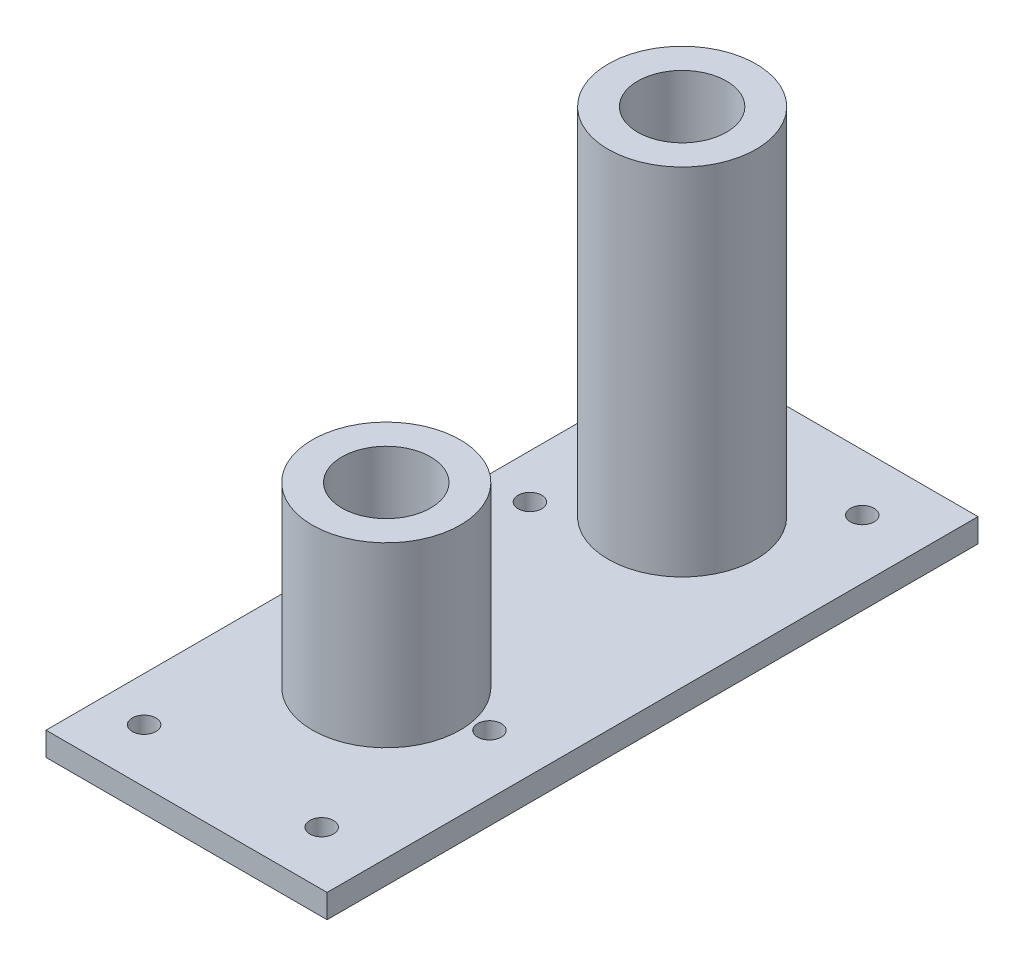
ISO-10303-21;
HEADER;
FILE_DESCRIPTION(('STEP AP214'),'2;1');
FILE_NAME('part.step','',(''),(''),'','','');
FILE_SCHEMA(('AUTOMOTIVE_DESIGN { 1 0 10303 214 1 1 1 1 }'));
ENDSEC;
DATA;
#1=APPLICATION_CONTEXT('core data for automotive mechanical design processes');
#2=APPLICATION_PROTOCOL_DEFINITION('international standard','automotive_design',2000,#1);
#3=PRODUCT_CONTEXT('',#1,'mechanical');
#4=PRODUCT('Part','Part','',(#3));
#5=PRODUCT_RELATED_PRODUCT_CATEGORY('part','',(#4));
#6=PRODUCT_DEFINITION_FORMATION('','',#4);
#7=PRODUCT_DEFINITION_CONTEXT('part definition',#1,'design');
#8=PRODUCT_DEFINITION('design','',#6,#7);
#9=PRODUCT_DEFINITION_SHAPE('','',#8);
#10=(LENGTH_UNIT() NAMED_UNIT(*) SI_UNIT(.MILLI.,.METRE.));
#11=(NAMED_UNIT(*) PLANE_ANGLE_UNIT() SI_UNIT($,.RADIAN.));
#12=(NAMED_UNIT(*) SI_UNIT($,.STERADIAN.) SOLID_ANGLE_UNIT());
#13=UNCERTAINTY_MEASURE_WITH_UNIT(LENGTH_MEASURE(1.E-05),#10,'distance_accuracy_value','');
#14=(GEOMETRIC_REPRESENTATION_CONTEXT(3) GLOBAL_UNCERTAINTY_ASSIGNED_CONTEXT((#13)) GLOBAL_UNIT_ASSIGNED_CONTEXT((#10,
#11,#12)) REPRESENTATION_CONTEXT('',''));
#15=CARTESIAN_POINT('',(0.,0.,0.));
#16=DIRECTION('',(0.,0.,1.));
#17=DIRECTION('',(1.,0.,0.));
#18=AXIS2_PLACEMENT_3D('',#15,#16,#17);
#19=CARTESIAN_POINT('',(0.,0.,0.));
#20=DIRECTION('',(0.,1.,0.));
#21=DIRECTION('',(0.,0.,1.));
#22=AXIS2_PLACEMENT_3D('',#19,#20,#21);
#23=PLANE('',#22);
#24=DIRECTION('',(0.,0.,-1.));
#25=VECTOR('',#24,1.);
#26=CARTESIAN_POINT('',(-9.14772727272729,0.,-6.875));
#27=LINE('',#26,#25);
#28=CARTESIAN_POINT('',(-9.14772727272729,0.,3.125));
#29=VERTEX_POINT('',#28);
#30=CARTESIAN_POINT('',(-9.14772727272729,0.,-6.875));
#31=VERTEX_POINT('',#30);
#32=EDGE_CURVE('E186',#29,#31,#27,.T.);
#33=ORIENTED_EDGE('',*,*,#32,.F.);
#34=DIRECTION('',(1.,0.,0.));
#35=VECTOR('',#34,1.);
#36=CARTESIAN_POINT('',(-19.1477272727273,0.,3.125));
#37=LINE('',#36,#35);
#38=CARTESIAN_POINT('',(-19.1477272727273,0.,3.125));
#39=VERTEX_POINT('',#38);
#40=EDGE_CURVE('E197',#39,#29,#37,.T.);
#41=ORIENTED_EDGE('',*,*,#40,.F.);
#42=DIRECTION('',(0.,0.,1.));
#43=VECTOR('',#42,1.);
#44=CARTESIAN_POINT('',(-19.1477272727273,0.,-6.875));
#45=LINE('',#44,#43);
#46=CARTESIAN_POINT('',(-19.1477272727273,0.,-6.875));
#47=VERTEX_POINT('',#46);
#48=EDGE_CURVE('E216',#47,#39,#45,.T.);
#49=ORIENTED_EDGE('',*,*,#48,.F.);
#50=DIRECTION('',(-1.,0.,0.));
#51=VECTOR('',#50,1.);
#52=CARTESIAN_POINT('',(-19.1477272727273,0.,-6.875));
#53=LINE('',#52,#51);
#54=EDGE_CURVE('E212',#31,#47,#53,.T.);
#55=ORIENTED_EDGE('',*,*,#54,.F.);
#56=EDGE_LOOP('',(#33,#41,#49,#55));
#57=FACE_BOUND('',#56,.T.);
#58=CARTESIAN_POINT('',(-14.1477272727273,0.,-1.875));
#59=DIRECTION('',(0.,1.,0.));
#60=DIRECTION('',(0.,0.,1.));
#61=AXIS2_PLACEMENT_3D('',#58,#59,#60);
#62=CIRCLE('',#61,7.5);
#63=CARTESIAN_POINT('',(-14.1477272727273,0.,5.625));
#64=VERTEX_POINT('',#63);
#65=EDGE_CURVE('E12',#64,#64,#62,.F.);
#66=ORIENTED_EDGE('',*,*,#65,.F.);
#67=EDGE_LOOP('',(#66));
#68=FACE_BOUND('',#67,.T.);
#69=ADVANCED_FACE('F49',(#57,#68),#23,.T.);
#70=DIRECTION('',(0.,0.,-1.));
#71=VECTOR('',#70,1.);
#72=CARTESIAN_POINT('',(-9.14772727272729,0.,43.125));
#73=LINE('',#72,#71);
#74=CARTESIAN_POINT('',(-9.14772727272729,0.,53.125));
#75=VERTEX_POINT('',#74);
#76=CARTESIAN_POINT('',(-9.14772727272729,0.,43.125));
#77=VERTEX_POINT('',#76);
#78=EDGE_CURVE('E73',#75,#77,#73,.T.);
#79=ORIENTED_EDGE('',*,*,#78,.F.);
#80=DIRECTION('',(1.,0.,0.));
#81=VECTOR('',#80,1.);
#82=CARTESIAN_POINT('',(-19.1477272727273,0.,53.125));
#83=LINE('',#82,#81);
#84=CARTESIAN_POINT('',(-19.1477272727273,0.,53.125));
#85=VERTEX_POINT('',#84);
#86=EDGE_CURVE('E160',#85,#75,#83,.T.);
#87=ORIENTED_EDGE('',*,*,#86,.F.);
#88=DIRECTION('',(0.,0.,1.));
#89=VECTOR('',#88,1.);
#90=CARTESIAN_POINT('',(-19.1477272727273,0.,43.125));
#91=LINE('',#90,#89);
#92=CARTESIAN_POINT('',(-19.1477272727273,0.,43.125));
#93=VERTEX_POINT('',#92);
#94=EDGE_CURVE('E164',#93,#85,#91,.T.);
#95=ORIENTED_EDGE('',*,*,#94,.F.);
#96=DIRECTION('',(-1.,0.,0.));
#97=VECTOR('',#96,1.);
#98=CARTESIAN_POINT('',(-19.1477272727273,0.,43.125));
#99=LINE('',#98,#97);
#100=EDGE_CURVE('E176',#77,#93,#99,.T.);
#101=ORIENTED_EDGE('',*,*,#100,.F.);
#102=EDGE_LOOP('',(#79,#87,#95,#101));
#103=FACE_BOUND('',#102,.T.);
#104=CARTESIAN_POINT('',(-14.1477272727273,0.,48.125));
#105=DIRECTION('',(0.,1.,0.));
#106=DIRECTION('',(0.,0.,1.));
#107=AXIS2_PLACEMENT_3D('',#104,#105,#106);
#108=CIRCLE('',#107,7.5);
#109=CARTESIAN_POINT('',(-14.1477272727273,0.,55.625));
#110=VERTEX_POINT('',#109);
#111=EDGE_CURVE('E58',#110,#110,#108,.F.);
#112=ORIENTED_EDGE('',*,*,#111,.F.);
#113=EDGE_LOOP('',(#112));
#114=FACE_BOUND('',#113,.T.);
#115=ADVANCED_FACE('F284',(#103,#114),#23,.T.);
#116=CARTESIAN_POINT('',(-36.6477272727273,-4.,-26.875));
#117=DIRECTION('',(-1.,0.,0.));
#118=DIRECTION('',(0.,0.,1.));
#119=AXIS2_PLACEMENT_3D('',#116,#117,#118);
#120=PLANE('',#119);
#121=DIRECTION('',(0.,0.,1.));
#122=VECTOR('',#121,1.);
#123=CARTESIAN_POINT('',(-36.6477272727273,0.,-26.875));
#124=LINE('',#123,#122);
#125=CARTESIAN_POINT('',(-36.6477272727273,0.,-26.875));
#126=VERTEX_POINT('',#125);
#127=CARTESIAN_POINT('',(-36.6477272727273,0.,83.125));
#128=VERTEX_POINT('',#127);
#129=EDGE_CURVE('E226',#126,#128,#124,.T.);
#130=ORIENTED_EDGE('',*,*,#129,.F.);
#131=DIRECTION('',(0.,1.,0.));
#132=VECTOR('',#131,1.);
#133=CARTESIAN_POINT('',(-36.6477272727273,-4.,-26.875));
#134=LINE('',#133,#132);
#135=CARTESIAN_POINT('',(-36.6477272727273,-4.,-26.875));
#136=VERTEX_POINT('',#135);
#137=EDGE_CURVE('E268',#136,#126,#134,.T.);
#138=ORIENTED_EDGE('',*,*,#137,.F.);
#139=DIRECTION('',(0.,0.,1.));
#140=VECTOR('',#139,1.);
#141=CARTESIAN_POINT('',(-36.6477272727273,-4.,-26.875));
#142=LINE('',#141,#140);
#143=CARTESIAN_POINT('',(-36.6477272727273,-4.,83.125));
#144=VERTEX_POINT('',#143);
#145=EDGE_CURVE('E236',#136,#144,#142,.T.);
#146=ORIENTED_EDGE('',*,*,#145,.T.);
#147=DIRECTION('',(0.,1.,0.));
#148=VECTOR('',#147,1.);
#149=CARTESIAN_POINT('',(-36.6477272727273,-4.,83.125));
#150=LINE('',#149,#148);
#151=EDGE_CURVE('E253',#144,#128,#150,.T.);
#152=ORIENTED_EDGE('',*,*,#151,.T.);
#153=EDGE_LOOP('',(#130,#138,#146,#152));
#154=FACE_BOUND('',#153,.T.);
#155=ADVANCED_FACE('F51',(#154),#120,.T.);
#156=CARTESIAN_POINT('',(-36.6477272727273,-4.,-26.875));
#157=DIRECTION('',(0.,0.,-1.));
#158=DIRECTION('',(-1.,0.,0.));
#159=AXIS2_PLACEMENT_3D('',#156,#157,#158);
#160=PLANE('',#159);
#161=DIRECTION('',(-1.,0.,0.));
#162=VECTOR('',#161,1.);
#163=CARTESIAN_POINT('',(-36.6477272727273,0.,-26.875));
#164=LINE('',#163,#162);
#165=CARTESIAN_POINT('',(10.8522727272727,0.,-26.875));
#166=VERTEX_POINT('',#165);
#167=EDGE_CURVE('E241',#166,#126,#164,.T.);
#168=ORIENTED_EDGE('',*,*,#167,.F.);
#169=DIRECTION('',(0.,1.,0.));
#170=VECTOR('',#169,1.);
#171=CARTESIAN_POINT('',(10.8522727272727,-4.,-26.875));
#172=LINE('',#171,#170);
#173=CARTESIAN_POINT('',(10.8522727272727,-4.,-26.875));
#174=VERTEX_POINT('',#173);
#175=EDGE_CURVE('E271',#174,#166,#172,.T.);
#176=ORIENTED_EDGE('',*,*,#175,.F.);
#177=DIRECTION('',(-1.,0.,0.));
#178=VECTOR('',#177,1.);
#179=CARTESIAN_POINT('',(-36.6477272727273,-4.,-26.875));
#180=LINE('',#179,#178);
#181=EDGE_CURVE('E249',#174,#136,#180,.T.);
#182=ORIENTED_EDGE('',*,*,#181,.T.);
#183=ORIENTED_EDGE('',*,*,#137,.T.);
#184=EDGE_LOOP('',(#168,#176,#182,#183));
#185=FACE_BOUND('',#184,.T.);
#186=ADVANCED_FACE('F293',(#185),#160,.T.);
#187=CARTESIAN_POINT('',(10.8522727272727,-4.,-26.875));
#188=DIRECTION('',(1.,0.,0.));
#189=DIRECTION('',(0.,0.,-1.));
#190=AXIS2_PLACEMENT_3D('',#187,#188,#189);
#191=PLANE('',#190);
#192=DIRECTION('',(0.,0.,-1.));
#193=VECTOR('',#192,1.);
#194=CARTESIAN_POINT('',(10.8522727272727,0.,-26.875));
#195=LINE('',#194,#193);
#196=CARTESIAN_POINT('',(10.8522727272727,0.,83.125));
#197=VERTEX_POINT('',#196);
#198=EDGE_CURVE('E261',#197,#166,#195,.T.);
#199=ORIENTED_EDGE('',*,*,#198,.F.);
#200=DIRECTION('',(0.,1.,0.));
#201=VECTOR('',#200,1.);
#202=CARTESIAN_POINT('',(10.8522727272727,-4.,83.125));
#203=LINE('',#202,#201);
#204=CARTESIAN_POINT('',(10.8522727272727,-4.,83.125));
#205=VERTEX_POINT('',#204);
#206=EDGE_CURVE('E274',#205,#197,#203,.T.);
#207=ORIENTED_EDGE('',*,*,#206,.F.);
#208=DIRECTION('',(0.,0.,-1.));
#209=VECTOR('',#208,1.);
#210=CARTESIAN_POINT('',(10.8522727272727,-4.,-26.875));
#211=LINE('',#210,#209);
#212=EDGE_CURVE('E245',#205,#174,#211,.T.);
#213=ORIENTED_EDGE('',*,*,#212,.T.);
#214=ORIENTED_EDGE('',*,*,#175,.T.);
#215=EDGE_LOOP('',(#199,#207,#213,#214));
#216=FACE_BOUND('',#215,.T.);
#217=ADVANCED_FACE('F346',(#216),#191,.T.);
#218=CARTESIAN_POINT('',(-36.6477272727273,-4.,83.125));
#219=DIRECTION('',(0.,0.,1.));
#220=DIRECTION('',(1.,0.,0.));
#221=AXIS2_PLACEMENT_3D('',#218,#219,#220);
#222=PLANE('',#221);
#223=DIRECTION('',(1.,0.,0.));
#224=VECTOR('',#223,1.);
#225=CARTESIAN_POINT('',(-36.6477272727273,0.,83.125));
#226=LINE('',#225,#224);
#227=EDGE_CURVE('E257',#128,#197,#226,.T.);
#228=ORIENTED_EDGE('',*,*,#227,.F.);
#229=ORIENTED_EDGE('',*,*,#151,.F.);
#230=DIRECTION('',(1.,0.,0.));
#231=VECTOR('',#230,1.);
#232=CARTESIAN_POINT('',(-36.6477272727273,-4.,83.125));
#233=LINE('',#232,#231);
#234=EDGE_CURVE('E240',#144,#205,#233,.T.);
#235=ORIENTED_EDGE('',*,*,#234,.T.);
#236=ORIENTED_EDGE('',*,*,#206,.T.);
#237=EDGE_LOOP('',(#228,#229,#235,#236));
#238=FACE_BOUND('',#237,.T.);
#239=ADVANCED_FACE('F308',(#238),#222,.T.);
#240=CARTESIAN_POINT('',(0.,-4.,0.));
#241=DIRECTION('',(0.,1.,0.));
#242=DIRECTION('',(0.,0.,1.));
#243=AXIS2_PLACEMENT_3D('',#240,#241,#242);
#244=PLANE('',#243);
#245=CARTESIAN_POINT('',(-29.1477272727273,-4.,74.045));
#246=DIRECTION('',(0.,1.,0.));
#247=DIRECTION('',(0.,0.,1.));
#248=AXIS2_PLACEMENT_3D('',#245,#246,#247);
#249=CIRCLE('',#248,2.);
#250=CARTESIAN_POINT('',(-29.1477272727273,-4.,76.045));
#251=VERTEX_POINT('',#250);
#252=EDGE_CURVE('E611',#251,#251,#249,.T.);
#253=ORIENTED_EDGE('',*,*,#252,.T.);
#254=EDGE_LOOP('',(#253));
#255=FACE_BOUND('',#254,.T.);
#256=CARTESIAN_POINT('',(0.852272727272722,-4.,74.045));
#257=DIRECTION('',(0.,1.,0.));
#258=DIRECTION('',(0.,0.,1.));
#259=AXIS2_PLACEMENT_3D('',#256,#257,#258);
#260=CIRCLE('',#259,2.);
#261=CARTESIAN_POINT('',(0.852272727272722,-4.,76.045));
#262=VERTEX_POINT('',#261);
#263=EDGE_CURVE('E617',#262,#262,#260,.T.);
#264=ORIENTED_EDGE('',*,*,#263,.T.);
#265=EDGE_LOOP('',(#264));
#266=FACE_BOUND('',#265,.T.);
#267=CARTESIAN_POINT('',(0.852272727272702,-4.,45.685));
#268=DIRECTION('',(0.,1.,0.));
#269=DIRECTION('',(0.,0.,1.));
#270=AXIS2_PLACEMENT_3D('',#267,#268,#269);
#271=CIRCLE('',#270,2.);
#272=CARTESIAN_POINT('',(0.852272727272702,-4.,47.685));
#273=VERTEX_POINT('',#272);
#274=EDGE_CURVE('E623',#273,#273,#271,.T.);
#275=ORIENTED_EDGE('',*,*,#274,.T.);
#276=EDGE_LOOP('',(#275));
#277=FACE_BOUND('',#276,.T.);
#278=CARTESIAN_POINT('',(-29.1477272727273,-4.,8.845));
#279=DIRECTION('',(0.,1.,0.));
#280=DIRECTION('',(0.,0.,1.));
#281=AXIS2_PLACEMENT_3D('',#278,#279,#280);
#282=CIRCLE('',#281,2.);
#283=CARTESIAN_POINT('',(-29.1477272727273,-4.,10.845));
#284=VERTEX_POINT('',#283);
#285=EDGE_CURVE('E629',#284,#284,#282,.T.);
#286=ORIENTED_EDGE('',*,*,#285,.T.);
#287=EDGE_LOOP('',(#286));
#288=FACE_BOUND('',#287,.T.);
#289=CARTESIAN_POINT('',(0.852272727272705,-4.,-17.315));
#290=DIRECTION('',(0.,1.,0.));
#291=DIRECTION('',(0.,0.,1.));
#292=AXIS2_PLACEMENT_3D('',#289,#290,#291);
#293=CIRCLE('',#292,2.);
#294=CARTESIAN_POINT('',(0.852272727272705,-4.,-15.315));
#295=VERTEX_POINT('',#294);
#296=EDGE_CURVE('E177',#295,#295,#293,.T.);
#297=ORIENTED_EDGE('',*,*,#296,.T.);
#298=EDGE_LOOP('',(#297));
#299=FACE_BOUND('',#298,.T.);
#300=DIRECTION('',(1.,0.,0.));
#301=VECTOR('',#300,1.);
#302=CARTESIAN_POINT('',(-19.1477272727273,-4.,53.125));
#303=LINE('',#302,#301);
#304=CARTESIAN_POINT('',(-19.1477272727273,-4.,53.125));
#305=VERTEX_POINT('',#304);
#306=CARTESIAN_POINT('',(-9.14772727272729,-4.,53.125));
#307=VERTEX_POINT('',#306);
#308=EDGE_CURVE('E148',#305,#307,#303,.T.);
#309=ORIENTED_EDGE('',*,*,#308,.T.);
#310=DIRECTION('',(0.,0.,-1.));
#311=VECTOR('',#310,1.);
#312=CARTESIAN_POINT('',(-9.14772727272729,-4.,43.125));
#313=LINE('',#312,#311);
#314=CARTESIAN_POINT('',(-9.14772727272729,-4.,43.125));
#315=VERTEX_POINT('',#314);
#316=EDGE_CURVE('E141',#307,#315,#313,.T.);
#317=ORIENTED_EDGE('',*,*,#316,.T.);
#318=DIRECTION('',(-1.,0.,0.));
#319=VECTOR('',#318,1.);
#320=CARTESIAN_POINT('',(-19.1477272727273,-4.,43.125));
#321=LINE('',#320,#319);
#322=CARTESIAN_POINT('',(-19.1477272727273,-4.,43.125));
#323=VERTEX_POINT('',#322);
#324=EDGE_CURVE('E151',#315,#323,#321,.T.);
#325=ORIENTED_EDGE('',*,*,#324,.T.);
#326=DIRECTION('',(0.,0.,1.));
#327=VECTOR('',#326,1.);
#328=CARTESIAN_POINT('',(-19.1477272727273,-4.,43.125));
#329=LINE('',#328,#327);
#330=EDGE_CURVE('E65',#323,#305,#329,.T.);
#331=ORIENTED_EDGE('',*,*,#330,.T.);
#332=EDGE_LOOP('',(#309,#317,#325,#331));
#333=FACE_BOUND('',#332,.T.);
#334=DIRECTION('',(1.,0.,0.));
#335=VECTOR('',#334,1.);
#336=CARTESIAN_POINT('',(-19.1477272727273,-4.,3.125));
#337=LINE('',#336,#335);
#338=CARTESIAN_POINT('',(-19.1477272727273,-4.,3.125));
#339=VERTEX_POINT('',#338);
#340=CARTESIAN_POINT('',(-9.14772727272729,-4.,3.125));
#341=VERTEX_POINT('',#340);
#342=EDGE_CURVE('E205',#339,#341,#337,.T.);
#343=ORIENTED_EDGE('',*,*,#342,.T.);
#344=DIRECTION('',(0.,0.,-1.));
#345=VECTOR('',#344,1.);
#346=CARTESIAN_POINT('',(-9.14772727272729,-4.,-6.875));
#347=LINE('',#346,#345);
#348=CARTESIAN_POINT('',(-9.14772727272729,-4.,-6.875));
#349=VERTEX_POINT('',#348);
#350=EDGE_CURVE('E192',#341,#349,#347,.T.);
#351=ORIENTED_EDGE('',*,*,#350,.T.);
#352=DIRECTION('',(-1.,0.,0.));
#353=VECTOR('',#352,1.);
#354=CARTESIAN_POINT('',(-19.1477272727273,-4.,-6.875));
#355=LINE('',#354,#353);
#356=CARTESIAN_POINT('',(-19.1477272727273,-4.,-6.875));
#357=VERTEX_POINT('',#356);
#358=EDGE_CURVE('E196',#349,#357,#355,.T.);
#359=ORIENTED_EDGE('',*,*,#358,.T.);
#360=DIRECTION('',(0.,0.,1.));
#361=VECTOR('',#360,1.);
#362=CARTESIAN_POINT('',(-19.1477272727273,-4.,-6.875));
#363=LINE('',#362,#361);
#364=EDGE_CURVE('E201',#357,#339,#363,.T.);
#365=ORIENTED_EDGE('',*,*,#364,.T.);
#366=EDGE_LOOP('',(#343,#351,#359,#365));
#367=FACE_BOUND('',#366,.T.);
#368=ORIENTED_EDGE('',*,*,#145,.F.);
#369=ORIENTED_EDGE('',*,*,#181,.F.);
#370=ORIENTED_EDGE('',*,*,#212,.F.);
#371=ORIENTED_EDGE('',*,*,#234,.F.);
#372=EDGE_LOOP('',(#368,#369,#370,#371));
#373=FACE_BOUND('',#372,.T.);
#374=ADVANCED_FACE('F156',(#255,#266,#277,#288,#299,#333,#367,#373),#244,.F.);
#375=CARTESIAN_POINT('',(-14.1477272727273,0.,-1.875));
#376=DIRECTION('',(0.,1.,0.));
#377=DIRECTION('',(0.,0.,1.));
#378=AXIS2_PLACEMENT_3D('',#375,#376,#377);
#379=CIRCLE('',#378,12.5);
#380=CARTESIAN_POINT('',(-14.1477272727273,0.,10.625));
#381=VERTEX_POINT('',#380);
#382=EDGE_CURVE('E313',#381,#381,#379,.T.);
#383=ORIENTED_EDGE('',*,*,#382,.F.);
#384=EDGE_LOOP('',(#383));
#385=FACE_BOUND('',#384,.T.);
#386=CARTESIAN_POINT('',(-14.1477272727273,0.,48.125));
#387=DIRECTION('',(0.,1.,0.));
#388=DIRECTION('',(0.,0.,1.));
#389=AXIS2_PLACEMENT_3D('',#386,#387,#388);
#390=CIRCLE('',#389,12.5);
#391=CARTESIAN_POINT('',(-14.1477272727273,0.,60.625));
#392=VERTEX_POINT('',#391);
#393=EDGE_CURVE('E317',#392,#392,#390,.T.);
#394=ORIENTED_EDGE('',*,*,#393,.F.);
#395=EDGE_LOOP('',(#394));
#396=FACE_BOUND('',#395,.T.);
#397=CARTESIAN_POINT('',(-29.1477272727273,0.,74.045));
#398=DIRECTION('',(0.,1.,0.));
#399=DIRECTION('',(0.,0.,1.));
#400=AXIS2_PLACEMENT_3D('',#397,#398,#399);
#401=CIRCLE('',#400,2.);
#402=CARTESIAN_POINT('',(-29.1477272727273,0.,76.045));
#403=VERTEX_POINT('',#402);
#404=EDGE_CURVE('E321',#403,#403,#401,.T.);
#405=ORIENTED_EDGE('',*,*,#404,.F.);
#406=EDGE_LOOP('',(#405));
#407=FACE_BOUND('',#406,.T.);
#408=CARTESIAN_POINT('',(0.852272727272722,0.,74.045));
#409=DIRECTION('',(0.,1.,0.));
#410=DIRECTION('',(0.,0.,1.));
#411=AXIS2_PLACEMENT_3D('',#408,#409,#410);
#412=CIRCLE('',#411,2.);
#413=CARTESIAN_POINT('',(0.852272727272722,0.,76.045));
#414=VERTEX_POINT('',#413);
#415=EDGE_CURVE('E325',#414,#414,#412,.T.);
#416=ORIENTED_EDGE('',*,*,#415,.F.);
#417=EDGE_LOOP('',(#416));
#418=FACE_BOUND('',#417,.T.);
#419=CARTESIAN_POINT('',(0.852272727272702,0.,45.685));
#420=DIRECTION('',(0.,1.,0.));
#421=DIRECTION('',(0.,0.,1.));
#422=AXIS2_PLACEMENT_3D('',#419,#420,#421);
#423=CIRCLE('',#422,2.);
#424=CARTESIAN_POINT('',(0.852272727272702,0.,47.685));
#425=VERTEX_POINT('',#424);
#426=EDGE_CURVE('E329',#425,#425,#423,.T.);
#427=ORIENTED_EDGE('',*,*,#426,.F.);
#428=EDGE_LOOP('',(#427));
#429=FACE_BOUND('',#428,.T.);
#430=CARTESIAN_POINT('',(-29.1477272727273,0.,8.845));
#431=DIRECTION('',(0.,1.,0.));
#432=DIRECTION('',(0.,0.,1.));
#433=AXIS2_PLACEMENT_3D('',#430,#431,#432);
#434=CIRCLE('',#433,2.);
#435=CARTESIAN_POINT('',(-29.1477272727273,0.,10.845));
#436=VERTEX_POINT('',#435);
#437=EDGE_CURVE('E333',#436,#436,#434,.T.);
#438=ORIENTED_EDGE('',*,*,#437,.F.);
#439=EDGE_LOOP('',(#438));
#440=FACE_BOUND('',#439,.T.);
#441=CARTESIAN_POINT('',(0.852272727272705,0.,-17.315));
#442=DIRECTION('',(0.,1.,0.));
#443=DIRECTION('',(0.,0.,1.));
#444=AXIS2_PLACEMENT_3D('',#441,#442,#443);
#445=CIRCLE('',#444,2.);
#446=CARTESIAN_POINT('',(0.852272727272705,0.,-15.315));
#447=VERTEX_POINT('',#446);
#448=EDGE_CURVE('E167',#447,#447,#445,.T.);
#449=ORIENTED_EDGE('',*,*,#448,.F.);
#450=EDGE_LOOP('',(#449));
#451=FACE_BOUND('',#450,.T.);
#452=ORIENTED_EDGE('',*,*,#129,.T.);
#453=ORIENTED_EDGE('',*,*,#227,.T.);
#454=ORIENTED_EDGE('',*,*,#198,.T.);
#455=ORIENTED_EDGE('',*,*,#167,.T.);
#456=EDGE_LOOP('',(#452,#453,#454,#455));
#457=FACE_BOUND('',#456,.T.);
#458=ADVANCED_FACE('F288',(#385,#396,#407,#418,#429,#440,#451,#457),#23,.T.);
#459=CARTESIAN_POINT('',(-9.14772727272729,-4.,-6.875));
#460=DIRECTION('',(1.,0.,0.));
#461=DIRECTION('',(0.,0.,-1.));
#462=AXIS2_PLACEMENT_3D('',#459,#460,#461);
#463=PLANE('',#462);
#464=ORIENTED_EDGE('',*,*,#32,.T.);
#465=DIRECTION('',(0.,1.,0.));
#466=VECTOR('',#465,1.);
#467=CARTESIAN_POINT('',(-9.14772727272729,-4.,-6.875));
#468=LINE('',#467,#466);
#469=EDGE_CURVE('E209',#349,#31,#468,.T.);
#470=ORIENTED_EDGE('',*,*,#469,.F.);
#471=ORIENTED_EDGE('',*,*,#350,.F.);
#472=DIRECTION('',(0.,1.,0.));
#473=VECTOR('',#472,1.);
#474=CARTESIAN_POINT('',(-9.14772727272729,-4.,3.125));
#475=LINE('',#474,#473);
#476=EDGE_CURVE('E223',#341,#29,#475,.T.);
#477=ORIENTED_EDGE('',*,*,#476,.T.);
#478=EDGE_LOOP('',(#464,#470,#471,#477));
#479=FACE_BOUND('',#478,.T.);
#480=ADVANCED_FACE('F299',(#479),#463,.F.);
#481=CARTESIAN_POINT('',(-19.1477272727273,-4.,3.125));
#482=DIRECTION('',(0.,0.,1.));
#483=DIRECTION('',(1.,0.,0.));
#484=AXIS2_PLACEMENT_3D('',#481,#482,#483);
#485=PLANE('',#484);
#486=ORIENTED_EDGE('',*,*,#40,.T.);
#487=ORIENTED_EDGE('',*,*,#476,.F.);
#488=ORIENTED_EDGE('',*,*,#342,.F.);
#489=DIRECTION('',(0.,1.,0.));
#490=VECTOR('',#489,1.);
#491=CARTESIAN_POINT('',(-19.1477272727273,-4.,3.125));
#492=LINE('',#491,#490);
#493=EDGE_CURVE('E227',#339,#39,#492,.T.);
#494=ORIENTED_EDGE('',*,*,#493,.T.);
#495=EDGE_LOOP('',(#486,#487,#488,#494));
#496=FACE_BOUND('',#495,.T.);
#497=ADVANCED_FACE('F305',(#496),#485,.F.);
#498=CARTESIAN_POINT('',(-19.1477272727273,-4.,-6.875));
#499=DIRECTION('',(-1.,0.,0.));
#500=DIRECTION('',(0.,0.,1.));
#501=AXIS2_PLACEMENT_3D('',#498,#499,#500);
#502=PLANE('',#501);
#503=ORIENTED_EDGE('',*,*,#48,.T.);
#504=ORIENTED_EDGE('',*,*,#493,.F.);
#505=ORIENTED_EDGE('',*,*,#364,.F.);
#506=DIRECTION('',(0.,1.,0.));
#507=VECTOR('',#506,1.);
#508=CARTESIAN_POINT('',(-19.1477272727273,-4.,-6.875));
#509=LINE('',#508,#507);
#510=EDGE_CURVE('E230',#357,#47,#509,.T.);
#511=ORIENTED_EDGE('',*,*,#510,.T.);
#512=EDGE_LOOP('',(#503,#504,#505,#511));
#513=FACE_BOUND('',#512,.T.);
#514=ADVANCED_FACE('F382',(#513),#502,.F.);
#515=CARTESIAN_POINT('',(-19.1477272727273,-4.,-6.875));
#516=DIRECTION('',(0.,0.,-1.));
#517=DIRECTION('',(-1.,0.,0.));
#518=AXIS2_PLACEMENT_3D('',#515,#516,#517);
#519=PLANE('',#518);
#520=ORIENTED_EDGE('',*,*,#54,.T.);
#521=ORIENTED_EDGE('',*,*,#510,.F.);
#522=ORIENTED_EDGE('',*,*,#358,.F.);
#523=ORIENTED_EDGE('',*,*,#469,.T.);
#524=EDGE_LOOP('',(#520,#521,#522,#523));
#525=FACE_BOUND('',#524,.T.);
#526=ADVANCED_FACE('F393',(#525),#519,.F.);
#527=CARTESIAN_POINT('',(-9.14772727272729,-4.,43.125));
#528=DIRECTION('',(1.,0.,0.));
#529=DIRECTION('',(0.,0.,-1.));
#530=AXIS2_PLACEMENT_3D('',#527,#528,#529);
#531=PLANE('',#530);
#532=ORIENTED_EDGE('',*,*,#78,.T.);
#533=DIRECTION('',(0.,1.,0.));
#534=VECTOR('',#533,1.);
#535=CARTESIAN_POINT('',(-9.14772727272729,-4.,43.125));
#536=LINE('',#535,#534);
#537=EDGE_CURVE('E137',#315,#77,#536,.T.);
#538=ORIENTED_EDGE('',*,*,#537,.F.);
#539=ORIENTED_EDGE('',*,*,#316,.F.);
#540=DIRECTION('',(0.,1.,0.));
#541=VECTOR('',#540,1.);
#542=CARTESIAN_POINT('',(-9.14772727272729,-4.,53.125));
#543=LINE('',#542,#541);
#544=EDGE_CURVE('E183',#307,#75,#543,.T.);
#545=ORIENTED_EDGE('',*,*,#544,.T.);
#546=EDGE_LOOP('',(#532,#538,#539,#545));
#547=FACE_BOUND('',#546,.T.);
#548=ADVANCED_FACE('F139',(#547),#531,.F.);
#549=CARTESIAN_POINT('',(-19.1477272727273,-4.,53.125));
#550=DIRECTION('',(0.,0.,1.));
#551=DIRECTION('',(1.,0.,0.));
#552=AXIS2_PLACEMENT_3D('',#549,#550,#551);
#553=PLANE('',#552);
#554=ORIENTED_EDGE('',*,*,#86,.T.);
#555=ORIENTED_EDGE('',*,*,#544,.F.);
#556=ORIENTED_EDGE('',*,*,#308,.F.);
#557=DIRECTION('',(0.,1.,0.));
#558=VECTOR('',#557,1.);
#559=CARTESIAN_POINT('',(-19.1477272727273,-4.,53.125));
#560=LINE('',#559,#558);
#561=EDGE_CURVE('E187',#305,#85,#560,.T.);
#562=ORIENTED_EDGE('',*,*,#561,.T.);
#563=EDGE_LOOP('',(#554,#555,#556,#562));
#564=FACE_BOUND('',#563,.T.);
#565=ADVANCED_FACE('F414',(#564),#553,.F.);
#566=CARTESIAN_POINT('',(-19.1477272727273,-4.,43.125));
#567=DIRECTION('',(-1.,0.,0.));
#568=DIRECTION('',(0.,0.,1.));
#569=AXIS2_PLACEMENT_3D('',#566,#567,#568);
#570=PLANE('',#569);
#571=ORIENTED_EDGE('',*,*,#94,.T.);
#572=ORIENTED_EDGE('',*,*,#561,.F.);
#573=ORIENTED_EDGE('',*,*,#330,.F.);
#574=DIRECTION('',(0.,1.,0.));
#575=VECTOR('',#574,1.);
#576=CARTESIAN_POINT('',(-19.1477272727273,-4.,43.125));
#577=LINE('',#576,#575);
#578=EDGE_CURVE('E147',#323,#93,#577,.T.);
#579=ORIENTED_EDGE('',*,*,#578,.T.);
#580=EDGE_LOOP('',(#571,#572,#573,#579));
#581=FACE_BOUND('',#580,.T.);
#582=ADVANCED_FACE('F424',(#581),#570,.F.);
#583=CARTESIAN_POINT('',(-19.1477272727273,-4.,43.125));
#584=DIRECTION('',(0.,0.,-1.));
#585=DIRECTION('',(-1.,0.,0.));
#586=AXIS2_PLACEMENT_3D('',#583,#584,#585);
#587=PLANE('',#586);
#588=ORIENTED_EDGE('',*,*,#100,.T.);
#589=ORIENTED_EDGE('',*,*,#578,.F.);
#590=ORIENTED_EDGE('',*,*,#324,.F.);
#591=ORIENTED_EDGE('',*,*,#537,.T.);
#592=EDGE_LOOP('',(#588,#589,#590,#591));
#593=FACE_BOUND('',#592,.T.);
#594=ADVANCED_FACE('F152',(#593),#587,.F.);
#595=CARTESIAN_POINT('',(0.852272727272705,-4.,-17.315));
#596=DIRECTION('',(0.,1.,0.));
#597=DIRECTION('',(0.,0.,1.));
#598=AXIS2_PLACEMENT_3D('',#595,#596,#597);
#599=CYLINDRICAL_SURFACE('',#598,2.);
#600=ORIENTED_EDGE('',*,*,#296,.F.);
#601=EDGE_LOOP('',(#600));
#602=FACE_BOUND('',#601,.T.);
#603=ORIENTED_EDGE('',*,*,#448,.T.);
#604=EDGE_LOOP('',(#603));
#605=FACE_BOUND('',#604,.T.);
#606=ADVANCED_FACE('F444',(#602,#605),#599,.F.);
#607=CARTESIAN_POINT('',(-29.1477272727273,-4.,8.845));
#608=DIRECTION('',(0.,1.,0.));
#609=DIRECTION('',(0.,0.,1.));
#610=AXIS2_PLACEMENT_3D('',#607,#608,#609);
#611=CYLINDRICAL_SURFACE('',#610,2.);
#612=ORIENTED_EDGE('',*,*,#285,.F.);
#613=EDGE_LOOP('',(#612));
#614=FACE_BOUND('',#613,.T.);
#615=ORIENTED_EDGE('',*,*,#437,.T.);
#616=EDGE_LOOP('',(#615));
#617=FACE_BOUND('',#616,.T.);
#618=ADVANCED_FACE('F454',(#614,#617),#611,.F.);
#619=CARTESIAN_POINT('',(0.852272727272702,-4.,45.685));
#620=DIRECTION('',(0.,1.,0.));
#621=DIRECTION('',(0.,0.,1.));
#622=AXIS2_PLACEMENT_3D('',#619,#620,#621);
#623=CYLINDRICAL_SURFACE('',#622,2.);
#624=ORIENTED_EDGE('',*,*,#274,.F.);
#625=EDGE_LOOP('',(#624));
#626=FACE_BOUND('',#625,.T.);
#627=ORIENTED_EDGE('',*,*,#426,.T.);
#628=EDGE_LOOP('',(#627));
#629=FACE_BOUND('',#628,.T.);
#630=ADVANCED_FACE('F465',(#626,#629),#623,.F.);
#631=CARTESIAN_POINT('',(0.852272727272722,-4.,74.045));
#632=DIRECTION('',(0.,1.,0.));
#633=DIRECTION('',(0.,0.,1.));
#634=AXIS2_PLACEMENT_3D('',#631,#632,#633);
#635=CYLINDRICAL_SURFACE('',#634,2.);
#636=ORIENTED_EDGE('',*,*,#263,.F.);
#637=EDGE_LOOP('',(#636));
#638=FACE_BOUND('',#637,.T.);
#639=ORIENTED_EDGE('',*,*,#415,.T.);
#640=EDGE_LOOP('',(#639));
#641=FACE_BOUND('',#640,.T.);
#642=ADVANCED_FACE('F476',(#638,#641),#635,.F.);
#643=CARTESIAN_POINT('',(-29.1477272727273,-4.,74.045));
#644=DIRECTION('',(0.,1.,0.));
#645=DIRECTION('',(0.,0.,1.));
#646=AXIS2_PLACEMENT_3D('',#643,#644,#645);
#647=CYLINDRICAL_SURFACE('',#646,2.);
#648=ORIENTED_EDGE('',*,*,#252,.F.);
#649=EDGE_LOOP('',(#648));
#650=FACE_BOUND('',#649,.T.);
#651=ORIENTED_EDGE('',*,*,#404,.T.);
#652=EDGE_LOOP('',(#651));
#653=FACE_BOUND('',#652,.T.);
#654=ADVANCED_FACE('F487',(#650,#653),#647,.F.);
#655=CARTESIAN_POINT('',(-14.1477272727273,30.,48.125));
#656=DIRECTION('',(0.,1.,0.));
#657=DIRECTION('',(0.,0.,1.));
#658=AXIS2_PLACEMENT_3D('',#655,#656,#657);
#659=PLANE('',#658);
#660=CARTESIAN_POINT('',(-14.1477272727273,30.,48.125));
#661=DIRECTION('',(0.,1.,0.));
#662=DIRECTION('',(0.,0.,1.));
#663=AXIS2_PLACEMENT_3D('',#660,#661,#662);
#664=CIRCLE('',#663,12.5);
#665=CARTESIAN_POINT('',(-14.1477272727273,30.,60.625));
#666=VERTEX_POINT('',#665);
#667=EDGE_CURVE('E605',#666,#666,#664,.T.);
#668=ORIENTED_EDGE('',*,*,#667,.T.);
#669=EDGE_LOOP('',(#668));
#670=FACE_BOUND('',#669,.T.);
#671=CARTESIAN_POINT('',(-14.1477272727273,30.,48.125));
#672=DIRECTION('',(0.,1.,0.));
#673=DIRECTION('',(0.,0.,1.));
#674=AXIS2_PLACEMENT_3D('',#671,#672,#673);
#675=CIRCLE('',#674,7.5);
#676=CARTESIAN_POINT('',(-14.1477272727273,30.,55.625));
#677=VERTEX_POINT('',#676);
#678=EDGE_CURVE('E600',#677,#677,#675,.T.);
#679=ORIENTED_EDGE('',*,*,#678,.F.);
#680=EDGE_LOOP('',(#679));
#681=FACE_BOUND('',#680,.T.);
#682=ADVANCED_FACE('F497',(#670,#681),#659,.T.);
#683=CARTESIAN_POINT('',(-14.1477272727273,30.,48.125));
#684=DIRECTION('',(0.,-1.,0.));
#685=DIRECTION('',(0.,0.,-1.));
#686=AXIS2_PLACEMENT_3D('',#683,#684,#685);
#687=CYLINDRICAL_SURFACE('',#686,12.5);
#688=ORIENTED_EDGE('',*,*,#667,.F.);
#689=EDGE_LOOP('',(#688));
#690=FACE_BOUND('',#689,.T.);
#691=ORIENTED_EDGE('',*,*,#393,.T.);
#692=EDGE_LOOP('',(#691));
#693=FACE_BOUND('',#692,.T.);
#694=ADVANCED_FACE('F514',(#690,#693),#687,.T.);
#695=CARTESIAN_POINT('',(-14.1477272727273,30.,48.125));
#696=DIRECTION('',(0.,-1.,0.));
#697=DIRECTION('',(0.,0.,-1.));
#698=AXIS2_PLACEMENT_3D('',#695,#696,#697);
#699=CYLINDRICAL_SURFACE('',#698,7.5);
#700=ORIENTED_EDGE('',*,*,#678,.T.);
#701=EDGE_LOOP('',(#700));
#702=FACE_BOUND('',#701,.T.);
#703=ORIENTED_EDGE('',*,*,#111,.T.);
#704=EDGE_LOOP('',(#703));
#705=FACE_BOUND('',#704,.T.);
#706=ADVANCED_FACE('F282',(#702,#705),#699,.F.);
#707=CARTESIAN_POINT('',(-14.1477272727273,60.,-1.875));
#708=DIRECTION('',(0.,1.,0.));
#709=DIRECTION('',(0.,0.,1.));
#710=AXIS2_PLACEMENT_3D('',#707,#708,#709);
#711=PLANE('',#710);
#712=CARTESIAN_POINT('',(-14.1477272727273,60.,-1.875));
#713=DIRECTION('',(0.,1.,0.));
#714=DIRECTION('',(0.,0.,1.));
#715=AXIS2_PLACEMENT_3D('',#712,#713,#714);
#716=CIRCLE('',#715,12.5);
#717=CARTESIAN_POINT('',(-14.1477272727273,60.,10.625));
#718=VERTEX_POINT('',#717);
#719=EDGE_CURVE('E595',#718,#718,#716,.T.);
#720=ORIENTED_EDGE('',*,*,#719,.T.);
#721=EDGE_LOOP('',(#720));
#722=FACE_BOUND('',#721,.T.);
#723=CARTESIAN_POINT('',(-14.1477272727273,60.,-1.875));
#724=DIRECTION('',(0.,1.,0.));
#725=DIRECTION('',(0.,0.,1.));
#726=AXIS2_PLACEMENT_3D('',#723,#724,#725);
#727=CIRCLE('',#726,7.5);
#728=CARTESIAN_POINT('',(-14.1477272727273,60.,5.625));
#729=VERTEX_POINT('',#728);
#730=EDGE_CURVE('E588',#729,#729,#727,.T.);
#731=ORIENTED_EDGE('',*,*,#730,.F.);
#732=EDGE_LOOP('',(#731));
#733=FACE_BOUND('',#732,.T.);
#734=ADVANCED_FACE('F534',(#722,#733),#711,.T.);
#735=CARTESIAN_POINT('',(-14.1477272727273,60.,-1.875));
#736=DIRECTION('',(0.,-1.,0.));
#737=DIRECTION('',(0.,0.,-1.));
#738=AXIS2_PLACEMENT_3D('',#735,#736,#737);
#739=CYLINDRICAL_SURFACE('',#738,12.5);
#740=ORIENTED_EDGE('',*,*,#719,.F.);
#741=EDGE_LOOP('',(#740));
#742=FACE_BOUND('',#741,.T.);
#743=ORIENTED_EDGE('',*,*,#382,.T.);
#744=EDGE_LOOP('',(#743));
#745=FACE_BOUND('',#744,.T.);
#746=ADVANCED_FACE('F556',(#742,#745),#739,.T.);
#747=CARTESIAN_POINT('',(-14.1477272727273,60.,-1.875));
#748=DIRECTION('',(0.,-1.,0.));
#749=DIRECTION('',(0.,0.,-1.));
#750=AXIS2_PLACEMENT_3D('',#747,#748,#749);
#751=CYLINDRICAL_SURFACE('',#750,7.5);
#752=ORIENTED_EDGE('',*,*,#730,.T.);
#753=EDGE_LOOP('',(#752));
#754=FACE_BOUND('',#753,.T.);
#755=ORIENTED_EDGE('',*,*,#65,.T.);
#756=EDGE_LOOP('',(#755));
#757=FACE_BOUND('',#756,.T.);
#758=ADVANCED_FACE('F566',(#754,#757),#751,.F.);
#759=CLOSED_SHELL('',(#69,#115,#155,#186,#217,#239,#374,#458,#480,#497,#514,#526,#548,#565,#582,
#594,#606,#618,#630,#642,#654,#682,#694,#706,#734,#746,#758));
#760=MANIFOLD_SOLID_BREP('B2',#759);
#761=ADVANCED_BREP_SHAPE_REPRESENTATION('',(#18,#760),#14);
#762=SHAPE_DEFINITION_REPRESENTATION(#9,#761);
ENDSEC;
END-ISO-10303-21;
